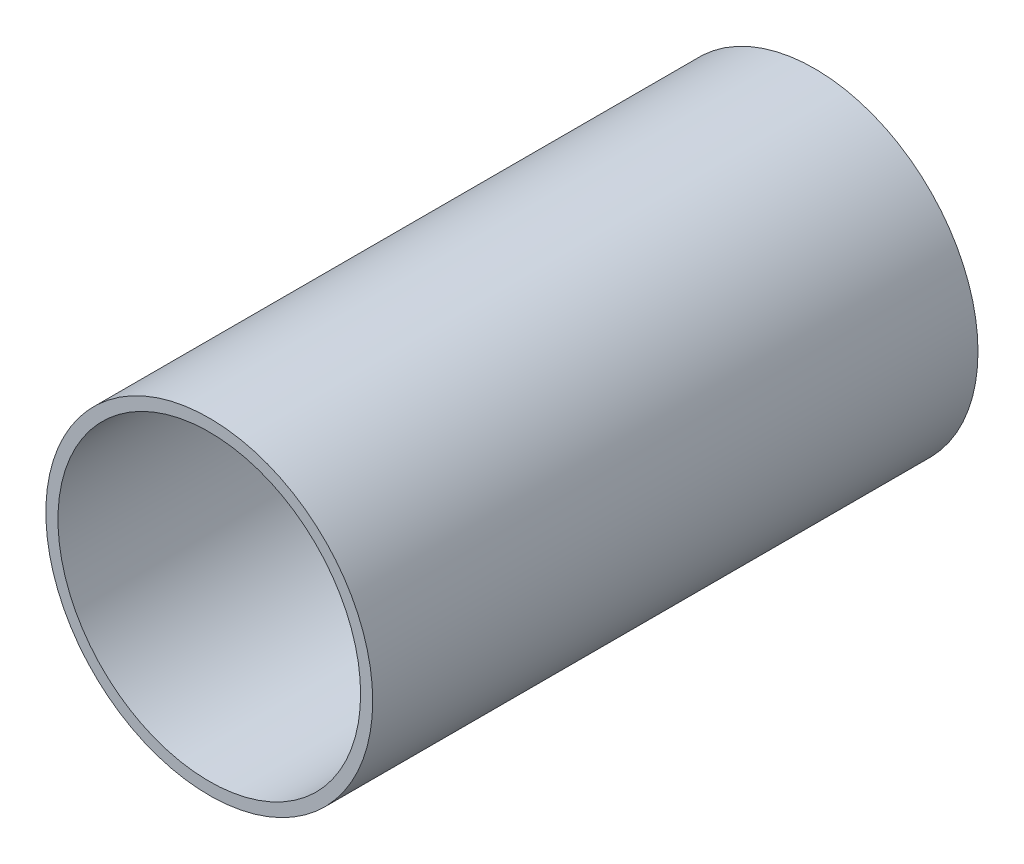
ISO-10303-21;
HEADER;
FILE_DESCRIPTION(('STEP AP214'),'2;1');
FILE_NAME('part.step','',(''),(''),'','','');
FILE_SCHEMA(('AUTOMOTIVE_DESIGN { 1 0 10303 214 1 1 1 1 }'));
ENDSEC;
DATA;
#1=APPLICATION_CONTEXT('core data for automotive mechanical design processes');
#2=APPLICATION_PROTOCOL_DEFINITION('international standard','automotive_design',2000,#1);
#3=PRODUCT_CONTEXT('',#1,'mechanical');
#4=PRODUCT('Part','Part','',(#3));
#5=PRODUCT_RELATED_PRODUCT_CATEGORY('part','',(#4));
#6=PRODUCT_DEFINITION_FORMATION('','',#4);
#7=PRODUCT_DEFINITION_CONTEXT('part definition',#1,'design');
#8=PRODUCT_DEFINITION('design','',#6,#7);
#9=PRODUCT_DEFINITION_SHAPE('','',#8);
#10=(LENGTH_UNIT() NAMED_UNIT(*) SI_UNIT(.MILLI.,.METRE.));
#11=(NAMED_UNIT(*) PLANE_ANGLE_UNIT() SI_UNIT($,.RADIAN.));
#12=(NAMED_UNIT(*) SI_UNIT($,.STERADIAN.) SOLID_ANGLE_UNIT());
#13=UNCERTAINTY_MEASURE_WITH_UNIT(LENGTH_MEASURE(1.E-05),#10,'distance_accuracy_value','');
#14=(GEOMETRIC_REPRESENTATION_CONTEXT(3) GLOBAL_UNCERTAINTY_ASSIGNED_CONTEXT((#13)) GLOBAL_UNIT_ASSIGNED_CONTEXT((#10,
#11,#12)) REPRESENTATION_CONTEXT('',''));
#15=CARTESIAN_POINT('',(0.,0.,0.));
#16=DIRECTION('',(0.,0.,1.));
#17=DIRECTION('',(1.,0.,0.));
#18=AXIS2_PLACEMENT_3D('',#15,#16,#17);
#19=CARTESIAN_POINT('',(0.,0.,50.));
#20=DIRECTION('',(0.,0.,-1.));
#21=DIRECTION('',(-1.,0.,0.));
#22=AXIS2_PLACEMENT_3D('',#19,#20,#21);
#23=CYLINDRICAL_SURFACE('',#22,13.5);
#24=CARTESIAN_POINT('',(0.,0.,50.));
#25=DIRECTION('',(0.,0.,1.));
#26=DIRECTION('',(1.,0.,0.));
#27=AXIS2_PLACEMENT_3D('',#24,#25,#26);
#28=CIRCLE('',#27,13.5);
#29=CARTESIAN_POINT('',(13.5,0.,50.));
#30=VERTEX_POINT('',#29);
#31=EDGE_CURVE('E10',#30,#30,#28,.T.);
#32=ORIENTED_EDGE('',*,*,#31,.F.);
#33=EDGE_LOOP('',(#32));
#34=FACE_BOUND('',#33,.T.);
#35=CARTESIAN_POINT('',(0.,0.,0.));
#36=DIRECTION('',(0.,0.,1.));
#37=DIRECTION('',(1.,0.,0.));
#38=AXIS2_PLACEMENT_3D('',#35,#36,#37);
#39=CIRCLE('',#38,13.5);
#40=CARTESIAN_POINT('',(13.5,0.,0.));
#41=VERTEX_POINT('',#40);
#42=EDGE_CURVE('E49',#41,#41,#39,.T.);
#43=ORIENTED_EDGE('',*,*,#42,.T.);
#44=EDGE_LOOP('',(#43));
#45=FACE_BOUND('',#44,.T.);
#46=ADVANCED_FACE('F41',(#34,#45),#23,.T.);
#47=CARTESIAN_POINT('',(0.,0.,50.));
#48=DIRECTION('',(0.,0.,1.));
#49=DIRECTION('',(1.,0.,0.));
#50=AXIS2_PLACEMENT_3D('',#47,#48,#49);
#51=PLANE('',#50);
#52=CARTESIAN_POINT('',(0.,0.,50.));
#53=DIRECTION('',(0.,0.,1.));
#54=DIRECTION('',(1.,0.,0.));
#55=AXIS2_PLACEMENT_3D('',#52,#53,#54);
#56=CIRCLE('',#55,12.5);
#57=CARTESIAN_POINT('',(12.5,0.,50.));
#58=VERTEX_POINT('',#57);
#59=EDGE_CURVE('E56',#58,#58,#56,.T.);
#60=ORIENTED_EDGE('',*,*,#59,.F.);
#61=EDGE_LOOP('',(#60));
#62=FACE_BOUND('',#61,.T.);
#63=ORIENTED_EDGE('',*,*,#31,.T.);
#64=EDGE_LOOP('',(#63));
#65=FACE_BOUND('',#64,.T.);
#66=ADVANCED_FACE('F74',(#62,#65),#51,.T.);
#67=CARTESIAN_POINT('',(0.,0.,0.));
#68=DIRECTION('',(0.,0.,1.));
#69=DIRECTION('',(1.,0.,0.));
#70=AXIS2_PLACEMENT_3D('',#67,#68,#69);
#71=PLANE('',#70);
#72=CARTESIAN_POINT('',(0.,0.,0.));
#73=DIRECTION('',(0.,0.,1.));
#74=DIRECTION('',(1.,0.,0.));
#75=AXIS2_PLACEMENT_3D('',#72,#73,#74);
#76=CIRCLE('',#75,12.5);
#77=CARTESIAN_POINT('',(12.5,0.,0.));
#78=VERTEX_POINT('',#77);
#79=EDGE_CURVE('E44',#78,#78,#76,.T.);
#80=ORIENTED_EDGE('',*,*,#79,.T.);
#81=EDGE_LOOP('',(#80));
#82=FACE_BOUND('',#81,.T.);
#83=ORIENTED_EDGE('',*,*,#42,.F.);
#84=EDGE_LOOP('',(#83));
#85=FACE_BOUND('',#84,.T.);
#86=ADVANCED_FACE('F65',(#82,#85),#71,.F.);
#87=CARTESIAN_POINT('',(0.,0.,-50.));
#88=DIRECTION('',(0.,0.,1.));
#89=DIRECTION('',(1.,0.,0.));
#90=AXIS2_PLACEMENT_3D('',#87,#88,#89);
#91=CYLINDRICAL_SURFACE('',#90,12.5);
#92=ORIENTED_EDGE('',*,*,#59,.T.);
#93=EDGE_LOOP('',(#92));
#94=FACE_BOUND('',#93,.T.);
#95=ORIENTED_EDGE('',*,*,#79,.F.);
#96=EDGE_LOOP('',(#95));
#97=FACE_BOUND('',#96,.T.);
#98=ADVANCED_FACE('F68',(#94,#97),#91,.F.);
#99=CLOSED_SHELL('',(#46,#66,#86,#98));
#100=MANIFOLD_SOLID_BREP('B2',#99);
#101=ADVANCED_BREP_SHAPE_REPRESENTATION('',(#18,#100),#14);
#102=SHAPE_DEFINITION_REPRESENTATION(#9,#101);
ENDSEC;
END-ISO-10303-21;
